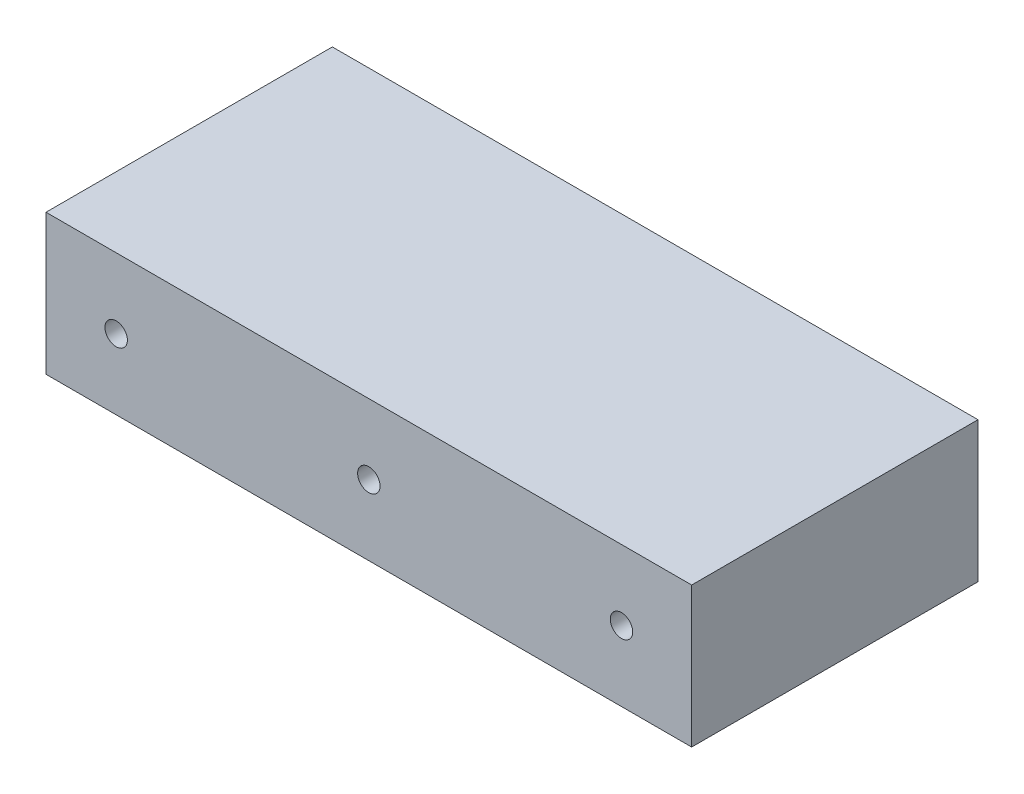
ISO-10303-21;
HEADER;
FILE_DESCRIPTION(('STEP AP214'),'2;1');
FILE_NAME('part.step','',(''),(''),'','','');
FILE_SCHEMA(('AUTOMOTIVE_DESIGN { 1 0 10303 214 1 1 1 1 }'));
ENDSEC;
DATA;
#1=APPLICATION_CONTEXT('core data for automotive mechanical design processes');
#2=APPLICATION_PROTOCOL_DEFINITION('international standard','automotive_design',2000,#1);
#3=PRODUCT_CONTEXT('',#1,'mechanical');
#4=PRODUCT('Part','Part','',(#3));
#5=PRODUCT_RELATED_PRODUCT_CATEGORY('part','',(#4));
#6=PRODUCT_DEFINITION_FORMATION('','',#4);
#7=PRODUCT_DEFINITION_CONTEXT('part definition',#1,'design');
#8=PRODUCT_DEFINITION('design','',#6,#7);
#9=PRODUCT_DEFINITION_SHAPE('','',#8);
#10=(LENGTH_UNIT() NAMED_UNIT(*) SI_UNIT(.MILLI.,.METRE.));
#11=(NAMED_UNIT(*) PLANE_ANGLE_UNIT() SI_UNIT($,.RADIAN.));
#12=(NAMED_UNIT(*) SI_UNIT($,.STERADIAN.) SOLID_ANGLE_UNIT());
#13=UNCERTAINTY_MEASURE_WITH_UNIT(LENGTH_MEASURE(1.E-05),#10,'distance_accuracy_value','');
#14=(GEOMETRIC_REPRESENTATION_CONTEXT(3) GLOBAL_UNCERTAINTY_ASSIGNED_CONTEXT((#13)) GLOBAL_UNIT_ASSIGNED_CONTEXT((#10,
#11,#12)) REPRESENTATION_CONTEXT('',''));
#15=CARTESIAN_POINT('',(0.,0.,0.));
#16=DIRECTION('',(0.,0.,1.));
#17=DIRECTION('',(1.,0.,0.));
#18=AXIS2_PLACEMENT_3D('',#15,#16,#17);
#19=CARTESIAN_POINT('',(-115.,-25.,102.));
#20=DIRECTION('',(1.,0.,0.));
#21=DIRECTION('',(0.,0.,-1.));
#22=AXIS2_PLACEMENT_3D('',#19,#20,#21);
#23=PLANE('',#22);
#24=DIRECTION('',(0.,-1.,0.));
#25=VECTOR('',#24,1.);
#26=CARTESIAN_POINT('',(-115.,-25.,0.));
#27=LINE('',#26,#25);
#28=CARTESIAN_POINT('',(-115.,25.,0.));
#29=VERTEX_POINT('',#28);
#30=CARTESIAN_POINT('',(-115.,-25.,0.));
#31=VERTEX_POINT('',#30);
#32=EDGE_CURVE('E104',#29,#31,#27,.T.);
#33=ORIENTED_EDGE('',*,*,#32,.T.);
#34=DIRECTION('',(0.,0.,-1.));
#35=VECTOR('',#34,1.);
#36=CARTESIAN_POINT('',(-115.,-25.,102.));
#37=LINE('',#36,#35);
#38=CARTESIAN_POINT('',(-115.,-25.,102.));
#39=VERTEX_POINT('',#38);
#40=EDGE_CURVE('E11',#39,#31,#37,.T.);
#41=ORIENTED_EDGE('',*,*,#40,.F.);
#42=DIRECTION('',(0.,-1.,0.));
#43=VECTOR('',#42,1.);
#44=CARTESIAN_POINT('',(-115.,-25.,102.));
#45=LINE('',#44,#43);
#46=CARTESIAN_POINT('',(-115.,25.,102.));
#47=VERTEX_POINT('',#46);
#48=EDGE_CURVE('E92',#47,#39,#45,.T.);
#49=ORIENTED_EDGE('',*,*,#48,.F.);
#50=DIRECTION('',(0.,0.,-1.));
#51=VECTOR('',#50,1.);
#52=CARTESIAN_POINT('',(-115.,25.,102.));
#53=LINE('',#52,#51);
#54=EDGE_CURVE('E100',#47,#29,#53,.T.);
#55=ORIENTED_EDGE('',*,*,#54,.T.);
#56=EDGE_LOOP('',(#33,#41,#49,#55));
#57=FACE_BOUND('',#56,.T.);
#58=ADVANCED_FACE('F41',(#57),#23,.F.);
#59=CARTESIAN_POINT('',(115.,-25.,102.));
#60=DIRECTION('',(0.,1.,0.));
#61=DIRECTION('',(-1.,0.,0.));
#62=AXIS2_PLACEMENT_3D('',#59,#60,#61);
#63=PLANE('',#62);
#64=DIRECTION('',(1.,0.,0.));
#65=VECTOR('',#64,1.);
#66=CARTESIAN_POINT('',(115.,-25.,0.));
#67=LINE('',#66,#65);
#68=CARTESIAN_POINT('',(115.,-25.,0.));
#69=VERTEX_POINT('',#68);
#70=EDGE_CURVE('E96',#31,#69,#67,.T.);
#71=ORIENTED_EDGE('',*,*,#70,.T.);
#72=DIRECTION('',(0.,0.,-1.));
#73=VECTOR('',#72,1.);
#74=CARTESIAN_POINT('',(115.,-25.,102.));
#75=LINE('',#74,#73);
#76=CARTESIAN_POINT('',(115.,-25.,102.));
#77=VERTEX_POINT('',#76);
#78=EDGE_CURVE('E49',#77,#69,#75,.T.);
#79=ORIENTED_EDGE('',*,*,#78,.F.);
#80=DIRECTION('',(1.,0.,0.));
#81=VECTOR('',#80,1.);
#82=CARTESIAN_POINT('',(115.,-25.,102.));
#83=LINE('',#82,#81);
#84=EDGE_CURVE('E87',#39,#77,#83,.T.);
#85=ORIENTED_EDGE('',*,*,#84,.F.);
#86=ORIENTED_EDGE('',*,*,#40,.T.);
#87=EDGE_LOOP('',(#71,#79,#85,#86));
#88=FACE_BOUND('',#87,.T.);
#89=ADVANCED_FACE('F95',(#88),#63,.F.);
#90=CARTESIAN_POINT('',(115.,-25.,102.));
#91=DIRECTION('',(-1.,0.,0.));
#92=DIRECTION('',(0.,0.,1.));
#93=AXIS2_PLACEMENT_3D('',#90,#91,#92);
#94=PLANE('',#93);
#95=DIRECTION('',(0.,1.,0.));
#96=VECTOR('',#95,1.);
#97=CARTESIAN_POINT('',(115.,-25.,0.));
#98=LINE('',#97,#96);
#99=CARTESIAN_POINT('',(115.,25.,0.));
#100=VERTEX_POINT('',#99);
#101=EDGE_CURVE('E74',#69,#100,#98,.T.);
#102=ORIENTED_EDGE('',*,*,#101,.T.);
#103=DIRECTION('',(0.,0.,-1.));
#104=VECTOR('',#103,1.);
#105=CARTESIAN_POINT('',(115.,25.,102.));
#106=LINE('',#105,#104);
#107=CARTESIAN_POINT('',(115.,25.,102.));
#108=VERTEX_POINT('',#107);
#109=EDGE_CURVE('E97',#108,#100,#106,.T.);
#110=ORIENTED_EDGE('',*,*,#109,.F.);
#111=DIRECTION('',(0.,1.,0.));
#112=VECTOR('',#111,1.);
#113=CARTESIAN_POINT('',(115.,-25.,102.));
#114=LINE('',#113,#112);
#115=EDGE_CURVE('E90',#77,#108,#114,.T.);
#116=ORIENTED_EDGE('',*,*,#115,.F.);
#117=ORIENTED_EDGE('',*,*,#78,.T.);
#118=EDGE_LOOP('',(#102,#110,#116,#117));
#119=FACE_BOUND('',#118,.T.);
#120=ADVANCED_FACE('F98',(#119),#94,.F.);
#121=CARTESIAN_POINT('',(115.,25.,102.));
#122=DIRECTION('',(0.,-1.,0.));
#123=DIRECTION('',(1.,0.,0.));
#124=AXIS2_PLACEMENT_3D('',#121,#122,#123);
#125=PLANE('',#124);
#126=DIRECTION('',(-1.,0.,0.));
#127=VECTOR('',#126,1.);
#128=CARTESIAN_POINT('',(115.,25.,0.));
#129=LINE('',#128,#127);
#130=EDGE_CURVE('E80',#100,#29,#129,.T.);
#131=ORIENTED_EDGE('',*,*,#130,.T.);
#132=ORIENTED_EDGE('',*,*,#54,.F.);
#133=DIRECTION('',(-1.,0.,0.));
#134=VECTOR('',#133,1.);
#135=CARTESIAN_POINT('',(115.,25.,102.));
#136=LINE('',#135,#134);
#137=EDGE_CURVE('E57',#108,#47,#136,.T.);
#138=ORIENTED_EDGE('',*,*,#137,.F.);
#139=ORIENTED_EDGE('',*,*,#109,.T.);
#140=EDGE_LOOP('',(#131,#132,#138,#139));
#141=FACE_BOUND('',#140,.T.);
#142=ADVANCED_FACE('F112',(#141),#125,.F.);
#143=CARTESIAN_POINT('',(0.,0.,102.));
#144=DIRECTION('',(0.,0.,1.));
#145=DIRECTION('',(1.,0.,0.));
#146=AXIS2_PLACEMENT_3D('',#143,#144,#145);
#147=PLANE('',#146);
#148=CARTESIAN_POINT('',(-90.,0.,102.));
#149=DIRECTION('',(0.,0.,1.));
#150=DIRECTION('',(1.,0.,0.));
#151=AXIS2_PLACEMENT_3D('',#148,#149,#150);
#152=CIRCLE('',#151,4.00000000000001);
#153=CARTESIAN_POINT('',(-86.,0.,102.));
#154=VERTEX_POINT('',#153);
#155=EDGE_CURVE('E127',#154,#154,#152,.T.);
#156=ORIENTED_EDGE('',*,*,#155,.F.);
#157=EDGE_LOOP('',(#156));
#158=FACE_BOUND('',#157,.T.);
#159=CARTESIAN_POINT('',(90.,0.,102.));
#160=DIRECTION('',(0.,0.,1.));
#161=DIRECTION('',(1.,0.,0.));
#162=AXIS2_PLACEMENT_3D('',#159,#160,#161);
#163=CIRCLE('',#162,4.00000000000001);
#164=CARTESIAN_POINT('',(94.,0.,102.));
#165=VERTEX_POINT('',#164);
#166=EDGE_CURVE('E121',#165,#165,#163,.T.);
#167=ORIENTED_EDGE('',*,*,#166,.F.);
#168=EDGE_LOOP('',(#167));
#169=FACE_BOUND('',#168,.T.);
#170=CARTESIAN_POINT('',(0.,0.,102.));
#171=DIRECTION('',(0.,0.,1.));
#172=DIRECTION('',(1.,0.,0.));
#173=AXIS2_PLACEMENT_3D('',#170,#171,#172);
#174=CIRCLE('',#173,4.);
#175=CARTESIAN_POINT('',(4.,0.,102.));
#176=VERTEX_POINT('',#175);
#177=EDGE_CURVE('E118',#176,#176,#174,.T.);
#178=ORIENTED_EDGE('',*,*,#177,.F.);
#179=EDGE_LOOP('',(#178));
#180=FACE_BOUND('',#179,.T.);
#181=ORIENTED_EDGE('',*,*,#48,.T.);
#182=ORIENTED_EDGE('',*,*,#84,.T.);
#183=ORIENTED_EDGE('',*,*,#115,.T.);
#184=ORIENTED_EDGE('',*,*,#137,.T.);
#185=EDGE_LOOP('',(#181,#182,#183,#184));
#186=FACE_BOUND('',#185,.T.);
#187=ADVANCED_FACE('F88',(#158,#169,#180,#186),#147,.T.);
#188=CARTESIAN_POINT('',(0.,0.,0.));
#189=DIRECTION('',(0.,0.,1.));
#190=DIRECTION('',(1.,0.,0.));
#191=AXIS2_PLACEMENT_3D('',#188,#189,#190);
#192=PLANE('',#191);
#193=CARTESIAN_POINT('',(-90.,0.,0.));
#194=DIRECTION('',(0.,0.,1.));
#195=DIRECTION('',(1.,0.,0.));
#196=AXIS2_PLACEMENT_3D('',#193,#194,#195);
#197=CIRCLE('',#196,4.00000000000001);
#198=CARTESIAN_POINT('',(-86.,0.,0.));
#199=VERTEX_POINT('',#198);
#200=EDGE_CURVE('E124',#199,#199,#197,.T.);
#201=ORIENTED_EDGE('',*,*,#200,.T.);
#202=EDGE_LOOP('',(#201));
#203=FACE_BOUND('',#202,.T.);
#204=CARTESIAN_POINT('',(90.,0.,0.));
#205=DIRECTION('',(0.,0.,1.));
#206=DIRECTION('',(1.,0.,0.));
#207=AXIS2_PLACEMENT_3D('',#204,#205,#206);
#208=CIRCLE('',#207,4.00000000000001);
#209=CARTESIAN_POINT('',(94.,0.,0.));
#210=VERTEX_POINT('',#209);
#211=EDGE_CURVE('E130',#210,#210,#208,.T.);
#212=ORIENTED_EDGE('',*,*,#211,.T.);
#213=EDGE_LOOP('',(#212));
#214=FACE_BOUND('',#213,.T.);
#215=CARTESIAN_POINT('',(0.,0.,0.));
#216=DIRECTION('',(0.,0.,1.));
#217=DIRECTION('',(1.,0.,0.));
#218=AXIS2_PLACEMENT_3D('',#215,#216,#217);
#219=CIRCLE('',#218,4.);
#220=CARTESIAN_POINT('',(4.,0.,0.));
#221=VERTEX_POINT('',#220);
#222=EDGE_CURVE('E107',#221,#221,#219,.T.);
#223=ORIENTED_EDGE('',*,*,#222,.T.);
#224=EDGE_LOOP('',(#223));
#225=FACE_BOUND('',#224,.T.);
#226=ORIENTED_EDGE('',*,*,#32,.F.);
#227=ORIENTED_EDGE('',*,*,#130,.F.);
#228=ORIENTED_EDGE('',*,*,#101,.F.);
#229=ORIENTED_EDGE('',*,*,#70,.F.);
#230=EDGE_LOOP('',(#226,#227,#228,#229));
#231=FACE_BOUND('',#230,.T.);
#232=ADVANCED_FACE('F115',(#203,#214,#225,#231),#192,.F.);
#233=CARTESIAN_POINT('',(0.,0.,0.));
#234=DIRECTION('',(0.,0.,1.));
#235=DIRECTION('',(1.,0.,0.));
#236=AXIS2_PLACEMENT_3D('',#233,#234,#235);
#237=CYLINDRICAL_SURFACE('',#236,4.);
#238=ORIENTED_EDGE('',*,*,#222,.F.);
#239=EDGE_LOOP('',(#238));
#240=FACE_BOUND('',#239,.T.);
#241=ORIENTED_EDGE('',*,*,#177,.T.);
#242=EDGE_LOOP('',(#241));
#243=FACE_BOUND('',#242,.T.);
#244=ADVANCED_FACE('F144',(#240,#243),#237,.F.);
#245=CARTESIAN_POINT('',(90.,0.,0.));
#246=DIRECTION('',(0.,0.,1.));
#247=DIRECTION('',(1.,0.,0.));
#248=AXIS2_PLACEMENT_3D('',#245,#246,#247);
#249=CYLINDRICAL_SURFACE('',#248,4.00000000000001);
#250=ORIENTED_EDGE('',*,*,#211,.F.);
#251=EDGE_LOOP('',(#250));
#252=FACE_BOUND('',#251,.T.);
#253=ORIENTED_EDGE('',*,*,#166,.T.);
#254=EDGE_LOOP('',(#253));
#255=FACE_BOUND('',#254,.T.);
#256=ADVANCED_FACE('F136',(#252,#255),#249,.F.);
#257=CARTESIAN_POINT('',(-90.,0.,0.));
#258=DIRECTION('',(0.,0.,1.));
#259=DIRECTION('',(1.,0.,0.));
#260=AXIS2_PLACEMENT_3D('',#257,#258,#259);
#261=CYLINDRICAL_SURFACE('',#260,4.00000000000001);
#262=ORIENTED_EDGE('',*,*,#200,.F.);
#263=EDGE_LOOP('',(#262));
#264=FACE_BOUND('',#263,.T.);
#265=ORIENTED_EDGE('',*,*,#155,.T.);
#266=EDGE_LOOP('',(#265));
#267=FACE_BOUND('',#266,.T.);
#268=ADVANCED_FACE('F152',(#264,#267),#261,.F.);
#269=CLOSED_SHELL('',(#58,#89,#120,#142,#187,#232,#244,#256,#268));
#270=MANIFOLD_SOLID_BREP('B2',#269);
#271=ADVANCED_BREP_SHAPE_REPRESENTATION('',(#18,#270),#14);
#272=SHAPE_DEFINITION_REPRESENTATION(#9,#271);
ENDSEC;
END-ISO-10303-21;
